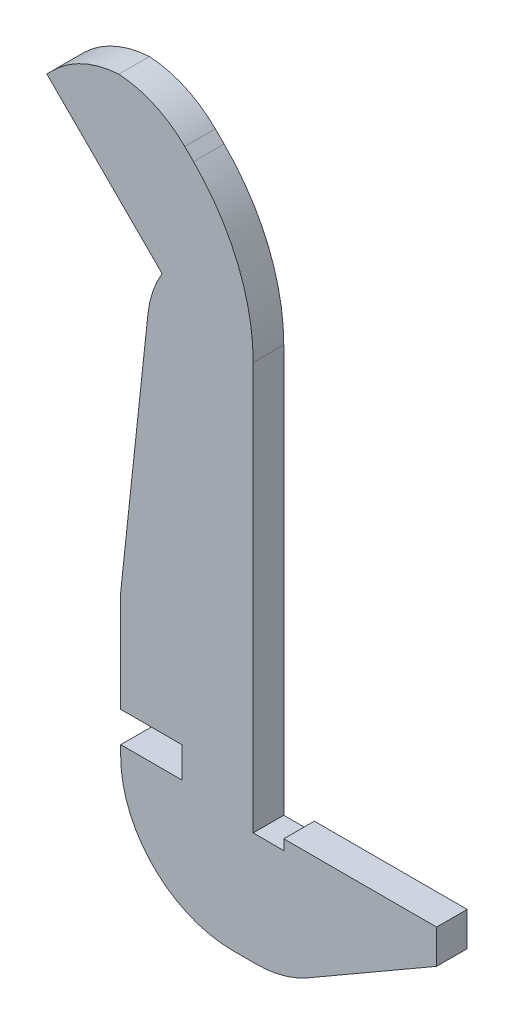
ISO-10303-21;
HEADER;
FILE_DESCRIPTION(('STEP AP214'),'2;1');
FILE_NAME('part.step','',(''),(''),'','','');
FILE_SCHEMA(('AUTOMOTIVE_DESIGN { 1 0 10303 214 1 1 1 1 }'));
ENDSEC;
DATA;
#1=APPLICATION_CONTEXT('core data for automotive mechanical design processes');
#2=APPLICATION_PROTOCOL_DEFINITION('international standard','automotive_design',2000,#1);
#3=PRODUCT_CONTEXT('',#1,'mechanical');
#4=PRODUCT('Part','Part','',(#3));
#5=PRODUCT_RELATED_PRODUCT_CATEGORY('part','',(#4));
#6=PRODUCT_DEFINITION_FORMATION('','',#4);
#7=PRODUCT_DEFINITION_CONTEXT('part definition',#1,'design');
#8=PRODUCT_DEFINITION('design','',#6,#7);
#9=PRODUCT_DEFINITION_SHAPE('','',#8);
#10=(LENGTH_UNIT() NAMED_UNIT(*) SI_UNIT(.MILLI.,.METRE.));
#11=(NAMED_UNIT(*) PLANE_ANGLE_UNIT() SI_UNIT($,.RADIAN.));
#12=(NAMED_UNIT(*) SI_UNIT($,.STERADIAN.) SOLID_ANGLE_UNIT());
#13=UNCERTAINTY_MEASURE_WITH_UNIT(LENGTH_MEASURE(1.E-05),#10,'distance_accuracy_value','');
#14=(GEOMETRIC_REPRESENTATION_CONTEXT(3) GLOBAL_UNCERTAINTY_ASSIGNED_CONTEXT((#13)) GLOBAL_UNIT_ASSIGNED_CONTEXT((#10,
#11,#12)) REPRESENTATION_CONTEXT('',''));
#15=CARTESIAN_POINT('',(0.,0.,0.));
#16=DIRECTION('',(0.,0.,1.));
#17=DIRECTION('',(1.,0.,0.));
#18=AXIS2_PLACEMENT_3D('',#15,#16,#17);
#19=CARTESIAN_POINT('',(-3.1,-1.2,0.15));
#20=DIRECTION('',(-1.,0.,0.));
#21=DIRECTION('',(0.,0.,1.));
#22=AXIS2_PLACEMENT_3D('',#19,#20,#21);
#23=PLANE('',#22);
#24=DIRECTION('',(0.,0.,1.));
#25=VECTOR('',#24,1.);
#26=CARTESIAN_POINT('',(-3.1,0.3,-0.15));
#27=LINE('',#26,#25);
#28=CARTESIAN_POINT('',(-3.1,0.3,-0.15));
#29=VERTEX_POINT('',#28);
#30=CARTESIAN_POINT('',(-3.1,0.3,0.15));
#31=VERTEX_POINT('',#30);
#32=EDGE_CURVE('E228',#29,#31,#27,.T.);
#33=ORIENTED_EDGE('',*,*,#32,.T.);
#34=DIRECTION('',(0.,1.,0.));
#35=VECTOR('',#34,1.);
#36=CARTESIAN_POINT('',(-3.1,-1.2,0.15));
#37=LINE('',#36,#35);
#38=CARTESIAN_POINT('',(-3.1,1.3,0.15));
#39=VERTEX_POINT('',#38);
#40=EDGE_CURVE('E359',#31,#39,#37,.T.);
#41=ORIENTED_EDGE('',*,*,#40,.T.);
#42=DIRECTION('',(0.,0.,-1.));
#43=VECTOR('',#42,1.);
#44=CARTESIAN_POINT('',(-3.1,1.3,0.15));
#45=LINE('',#44,#43);
#46=CARTESIAN_POINT('',(-3.1,1.3,-0.15));
#47=VERTEX_POINT('',#46);
#48=EDGE_CURVE('E280',#39,#47,#45,.T.);
#49=ORIENTED_EDGE('',*,*,#48,.T.);
#50=DIRECTION('',(0.,1.,0.));
#51=VECTOR('',#50,1.);
#52=CARTESIAN_POINT('',(-3.1,-1.2,-0.15));
#53=LINE('',#52,#51);
#54=EDGE_CURVE('E222',#29,#47,#53,.T.);
#55=ORIENTED_EDGE('',*,*,#54,.F.);
#56=EDGE_LOOP('',(#33,#41,#49,#55));
#57=FACE_BOUND('',#56,.T.);
#58=ADVANCED_FACE('F39',(#57),#23,.T.);
#59=CARTESIAN_POINT('',(-2.8,-1.2,0.15));
#60=DIRECTION('',(0.,1.,0.));
#61=DIRECTION('',(-1.,0.,0.));
#62=AXIS2_PLACEMENT_3D('',#59,#60,#61);
#63=PLANE('',#62);
#64=DIRECTION('',(1.,0.,0.));
#65=VECTOR('',#64,1.);
#66=CARTESIAN_POINT('',(-2.8,-1.2,-0.15));
#67=LINE('',#66,#65);
#68=CARTESIAN_POINT('',(-2.,-1.2,-0.15));
#69=VERTEX_POINT('',#68);
#70=CARTESIAN_POINT('',(-1.76794919243112,-1.2,-0.15));
#71=VERTEX_POINT('',#70);
#72=EDGE_CURVE('E254',#69,#71,#67,.T.);
#73=ORIENTED_EDGE('',*,*,#72,.T.);
#74=DIRECTION('',(0.,0.,-1.));
#75=VECTOR('',#74,1.);
#76=CARTESIAN_POINT('',(-1.76794919243112,-1.2,0.15));
#77=LINE('',#76,#75);
#78=CARTESIAN_POINT('',(-1.76794919243112,-1.2,0.15));
#79=VERTEX_POINT('',#78);
#80=EDGE_CURVE('E324',#71,#79,#77,.F.);
#81=ORIENTED_EDGE('',*,*,#80,.T.);
#82=DIRECTION('',(-1.,0.,0.));
#83=VECTOR('',#82,1.);
#84=CARTESIAN_POINT('',(-2.8,-1.2,0.15));
#85=LINE('',#84,#83);
#86=CARTESIAN_POINT('',(-2.,-1.2,0.15));
#87=VERTEX_POINT('',#86);
#88=EDGE_CURVE('E257',#79,#87,#85,.T.);
#89=ORIENTED_EDGE('',*,*,#88,.T.);
#90=DIRECTION('',(0.,0.,-1.));
#91=VECTOR('',#90,1.);
#92=CARTESIAN_POINT('',(-2.,-1.2,-0.15));
#93=LINE('',#92,#91);
#94=EDGE_CURVE('E261',#87,#69,#93,.T.);
#95=ORIENTED_EDGE('',*,*,#94,.T.);
#96=EDGE_LOOP('',(#73,#81,#89,#95));
#97=FACE_BOUND('',#96,.T.);
#98=ADVANCED_FACE('F426',(#97),#63,.F.);
#99=CARTESIAN_POINT('',(-1.5,-1.2,0.15));
#100=DIRECTION('',(-0.499999999999998,0.86602540378444,0.));
#101=DIRECTION('',(-0.86602540378444,-0.499999999999998,0.));
#102=AXIS2_PLACEMENT_3D('',#99,#100,#101);
#103=PLANE('',#102);
#104=DIRECTION('',(0.86602540378444,0.499999999999998,0.));
#105=VECTOR('',#104,1.);
#106=CARTESIAN_POINT('',(-1.5,-1.2,0.15));
#107=LINE('',#106,#105);
#108=CARTESIAN_POINT('',(-1.26794919243112,-1.06602540378444,0.15));
#109=VERTEX_POINT('',#108);
#110=CARTESIAN_POINT('',(0.,-0.333974596215566,0.15));
#111=VERTEX_POINT('',#110);
#112=EDGE_CURVE('E230',#109,#111,#107,.T.);
#113=ORIENTED_EDGE('',*,*,#112,.F.);
#114=DIRECTION('',(0.,0.,-1.));
#115=VECTOR('',#114,1.);
#116=CARTESIAN_POINT('',(-1.26794919243112,-1.06602540378444,0.15));
#117=LINE('',#116,#115);
#118=CARTESIAN_POINT('',(-1.26794919243112,-1.06602540378444,-0.15));
#119=VERTEX_POINT('',#118);
#120=EDGE_CURVE('E321',#109,#119,#117,.T.);
#121=ORIENTED_EDGE('',*,*,#120,.T.);
#122=DIRECTION('',(0.86602540378444,0.499999999999998,0.));
#123=VECTOR('',#122,1.);
#124=CARTESIAN_POINT('',(-1.5,-1.2,-0.15));
#125=LINE('',#124,#123);
#126=CARTESIAN_POINT('',(0.,-0.333974596215566,-0.15));
#127=VERTEX_POINT('',#126);
#128=EDGE_CURVE('E252',#119,#127,#125,.T.);
#129=ORIENTED_EDGE('',*,*,#128,.T.);
#130=DIRECTION('',(0.,0.,-1.));
#131=VECTOR('',#130,1.);
#132=CARTESIAN_POINT('',(0.,-0.333974596215566,0.15));
#133=LINE('',#132,#131);
#134=EDGE_CURVE('E258',#111,#127,#133,.T.);
#135=ORIENTED_EDGE('',*,*,#134,.F.);
#136=EDGE_LOOP('',(#113,#121,#129,#135));
#137=FACE_BOUND('',#136,.T.);
#138=ADVANCED_FACE('F382',(#137),#103,.F.);
#139=CARTESIAN_POINT('',(0.,-0.333974596215566,0.15));
#140=DIRECTION('',(-1.,0.,0.));
#141=DIRECTION('',(0.,-1.,0.));
#142=AXIS2_PLACEMENT_3D('',#139,#140,#141);
#143=PLANE('',#142);
#144=DIRECTION('',(0.,1.,0.));
#145=VECTOR('',#144,1.);
#146=CARTESIAN_POINT('',(0.,-0.333974596215566,-0.15));
#147=LINE('',#146,#145);
#148=CARTESIAN_POINT('',(0.,0.,-0.15));
#149=VERTEX_POINT('',#148);
#150=EDGE_CURVE('E250',#127,#149,#147,.T.);
#151=ORIENTED_EDGE('',*,*,#150,.T.);
#152=DIRECTION('',(0.,0.,-1.));
#153=VECTOR('',#152,1.);
#154=CARTESIAN_POINT('',(0.,0.,0.15));
#155=LINE('',#154,#153);
#156=CARTESIAN_POINT('',(0.,0.,0.15));
#157=VERTEX_POINT('',#156);
#158=EDGE_CURVE('E262',#157,#149,#155,.T.);
#159=ORIENTED_EDGE('',*,*,#158,.F.);
#160=DIRECTION('',(0.,1.,0.));
#161=VECTOR('',#160,1.);
#162=CARTESIAN_POINT('',(0.,-0.333974596215566,0.15));
#163=LINE('',#162,#161);
#164=EDGE_CURVE('E376',#111,#157,#163,.T.);
#165=ORIENTED_EDGE('',*,*,#164,.F.);
#166=ORIENTED_EDGE('',*,*,#134,.T.);
#167=EDGE_LOOP('',(#151,#159,#165,#166));
#168=FACE_BOUND('',#167,.T.);
#169=ADVANCED_FACE('F386',(#168),#143,.F.);
#170=CARTESIAN_POINT('',(0.,0.,0.15));
#171=DIRECTION('',(0.,-1.,0.));
#172=DIRECTION('',(0.,0.,-1.));
#173=AXIS2_PLACEMENT_3D('',#170,#171,#172);
#174=PLANE('',#173);
#175=DIRECTION('',(-1.,0.,0.));
#176=VECTOR('',#175,1.);
#177=CARTESIAN_POINT('',(0.,0.,-0.15));
#178=LINE('',#177,#176);
#179=CARTESIAN_POINT('',(-1.5,0.,-0.15));
#180=VERTEX_POINT('',#179);
#181=EDGE_CURVE('E248',#149,#180,#178,.T.);
#182=ORIENTED_EDGE('',*,*,#181,.T.);
#183=DIRECTION('',(0.,0.,-1.));
#184=VECTOR('',#183,1.);
#185=CARTESIAN_POINT('',(-1.5,0.,0.15));
#186=LINE('',#185,#184);
#187=CARTESIAN_POINT('',(-1.5,0.,0.15));
#188=VERTEX_POINT('',#187);
#189=EDGE_CURVE('E265',#188,#180,#186,.T.);
#190=ORIENTED_EDGE('',*,*,#189,.F.);
#191=DIRECTION('',(-1.,0.,0.));
#192=VECTOR('',#191,1.);
#193=CARTESIAN_POINT('',(0.,0.,0.15));
#194=LINE('',#193,#192);
#195=EDGE_CURVE('E375',#157,#188,#194,.T.);
#196=ORIENTED_EDGE('',*,*,#195,.F.);
#197=ORIENTED_EDGE('',*,*,#158,.T.);
#198=EDGE_LOOP('',(#182,#190,#196,#197));
#199=FACE_BOUND('',#198,.T.);
#200=ADVANCED_FACE('F391',(#199),#174,.F.);
#201=CARTESIAN_POINT('',(-1.5,0.,0.15));
#202=DIRECTION('',(1.,0.,0.));
#203=DIRECTION('',(0.,0.,-1.));
#204=AXIS2_PLACEMENT_3D('',#201,#202,#203);
#205=PLANE('',#204);
#206=DIRECTION('',(0.,-1.,0.));
#207=VECTOR('',#206,1.);
#208=CARTESIAN_POINT('',(-1.5,0.,-0.15));
#209=LINE('',#208,#207);
#210=CARTESIAN_POINT('',(-1.5,-0.1,-0.15));
#211=VERTEX_POINT('',#210);
#212=EDGE_CURVE('E246',#180,#211,#209,.T.);
#213=ORIENTED_EDGE('',*,*,#212,.T.);
#214=DIRECTION('',(0.,0.,-1.));
#215=VECTOR('',#214,1.);
#216=CARTESIAN_POINT('',(-1.5,-0.1,0.15));
#217=LINE('',#216,#215);
#218=CARTESIAN_POINT('',(-1.5,-0.1,0.15));
#219=VERTEX_POINT('',#218);
#220=EDGE_CURVE('E268',#219,#211,#217,.T.);
#221=ORIENTED_EDGE('',*,*,#220,.F.);
#222=DIRECTION('',(0.,-1.,0.));
#223=VECTOR('',#222,1.);
#224=CARTESIAN_POINT('',(-1.5,0.,0.15));
#225=LINE('',#224,#223);
#226=EDGE_CURVE('E373',#188,#219,#225,.T.);
#227=ORIENTED_EDGE('',*,*,#226,.F.);
#228=ORIENTED_EDGE('',*,*,#189,.T.);
#229=EDGE_LOOP('',(#213,#221,#227,#228));
#230=FACE_BOUND('',#229,.T.);
#231=ADVANCED_FACE('F397',(#230),#205,.F.);
#232=CARTESIAN_POINT('',(-1.5,-0.1,0.15));
#233=DIRECTION('',(0.,-1.,0.));
#234=DIRECTION('',(1.,0.,0.));
#235=AXIS2_PLACEMENT_3D('',#232,#233,#234);
#236=PLANE('',#235);
#237=DIRECTION('',(-1.,0.,0.));
#238=VECTOR('',#237,1.);
#239=CARTESIAN_POINT('',(-1.5,-0.1,-0.15));
#240=LINE('',#239,#238);
#241=CARTESIAN_POINT('',(-1.8,-0.1,-0.15));
#242=VERTEX_POINT('',#241);
#243=EDGE_CURVE('E244',#211,#242,#240,.T.);
#244=ORIENTED_EDGE('',*,*,#243,.T.);
#245=DIRECTION('',(0.,0.,-1.));
#246=VECTOR('',#245,1.);
#247=CARTESIAN_POINT('',(-1.8,-0.1,0.15));
#248=LINE('',#247,#246);
#249=CARTESIAN_POINT('',(-1.8,-0.1,0.15));
#250=VERTEX_POINT('',#249);
#251=EDGE_CURVE('E271',#250,#242,#248,.T.);
#252=ORIENTED_EDGE('',*,*,#251,.F.);
#253=DIRECTION('',(-1.,0.,0.));
#254=VECTOR('',#253,1.);
#255=CARTESIAN_POINT('',(-1.5,-0.1,0.15));
#256=LINE('',#255,#254);
#257=EDGE_CURVE('E370',#219,#250,#256,.T.);
#258=ORIENTED_EDGE('',*,*,#257,.F.);
#259=ORIENTED_EDGE('',*,*,#220,.T.);
#260=EDGE_LOOP('',(#244,#252,#258,#259));
#261=FACE_BOUND('',#260,.T.);
#262=ADVANCED_FACE('F401',(#261),#236,.F.);
#263=CARTESIAN_POINT('',(-1.8,-0.1,0.15));
#264=DIRECTION('',(-1.,0.,0.));
#265=DIRECTION('',(0.,0.,1.));
#266=AXIS2_PLACEMENT_3D('',#263,#264,#265);
#267=PLANE('',#266);
#268=DIRECTION('',(0.,1.,0.));
#269=VECTOR('',#268,1.);
#270=CARTESIAN_POINT('',(-1.8,-0.1,-0.15));
#271=LINE('',#270,#269);
#272=CARTESIAN_POINT('',(-1.8,3.89791847198289,-0.15));
#273=VERTEX_POINT('',#272);
#274=EDGE_CURVE('E240',#242,#273,#271,.T.);
#275=ORIENTED_EDGE('',*,*,#274,.T.);
#276=DIRECTION('',(0.,0.,-1.));
#277=VECTOR('',#276,1.);
#278=CARTESIAN_POINT('',(-1.8,3.89791847198289,0.15));
#279=LINE('',#278,#277);
#280=CARTESIAN_POINT('',(-1.8,3.89791847198289,0.15));
#281=VERTEX_POINT('',#280);
#282=EDGE_CURVE('E298',#273,#281,#279,.F.);
#283=ORIENTED_EDGE('',*,*,#282,.T.);
#284=DIRECTION('',(0.,1.,0.));
#285=VECTOR('',#284,1.);
#286=CARTESIAN_POINT('',(-1.8,3.51721108150116,0.15));
#287=LINE('',#286,#285);
#288=EDGE_CURVE('E366',#250,#281,#287,.T.);
#289=ORIENTED_EDGE('',*,*,#288,.F.);
#290=ORIENTED_EDGE('',*,*,#251,.T.);
#291=EDGE_LOOP('',(#275,#283,#289,#290));
#292=FACE_BOUND('',#291,.T.);
#293=ADVANCED_FACE('F404',(#292),#267,.F.);
#294=CARTESIAN_POINT('',(-1.8,4.72634559672908,0.15));
#295=DIRECTION('',(-0.70710678118655,-0.707106781186545,0.));
#296=DIRECTION('',(0.707106781186545,-0.70710678118655,0.));
#297=AXIS2_PLACEMENT_3D('',#294,#295,#296);
#298=PLANE('',#297);
#299=DIRECTION('',(-0.707106781186545,0.707106781186551,0.));
#300=VECTOR('',#299,1.);
#301=CARTESIAN_POINT('',(-1.8,4.72634559672908,-0.15));
#302=LINE('',#301,#300);
#303=CARTESIAN_POINT('',(-2.3857864376269,5.31213203435598,-0.15));
#304=VERTEX_POINT('',#303);
#305=CARTESIAN_POINT('',(-2.47175144212722,5.3980970388563,-0.15));
#306=VERTEX_POINT('',#305);
#307=EDGE_CURVE('E237',#304,#306,#302,.T.);
#308=ORIENTED_EDGE('',*,*,#307,.T.);
#309=DIRECTION('',(0.,0.,-1.));
#310=VECTOR('',#309,1.);
#311=CARTESIAN_POINT('',(-2.47175144212722,5.3980970388563,0.15));
#312=LINE('',#311,#310);
#313=CARTESIAN_POINT('',(-2.47175144212722,5.3980970388563,0.15));
#314=VERTEX_POINT('',#313);
#315=EDGE_CURVE('E11',#306,#314,#312,.F.);
#316=ORIENTED_EDGE('',*,*,#315,.T.);
#317=DIRECTION('',(-0.707106781186545,0.707106781186551,0.));
#318=VECTOR('',#317,1.);
#319=CARTESIAN_POINT('',(-1.8,4.72634559672908,0.15));
#320=LINE('',#319,#318);
#321=CARTESIAN_POINT('',(-2.3857864376269,5.31213203435598,0.15));
#322=VERTEX_POINT('',#321);
#323=EDGE_CURVE('E364',#322,#314,#320,.T.);
#324=ORIENTED_EDGE('',*,*,#323,.F.);
#325=DIRECTION('',(0.,0.,-1.));
#326=VECTOR('',#325,1.);
#327=CARTESIAN_POINT('',(-2.3857864376269,5.31213203435598,0.15));
#328=LINE('',#327,#326);
#329=EDGE_CURVE('E292',#322,#304,#328,.T.);
#330=ORIENTED_EDGE('',*,*,#329,.T.);
#331=EDGE_LOOP('',(#308,#316,#324,#330));
#332=FACE_BOUND('',#331,.T.);
#333=ADVANCED_FACE('F413',(#332),#298,.F.);
#334=CARTESIAN_POINT('',(-3.47175144212721,5.69099025766976,0.15));
#335=DIRECTION('',(0.707106781186545,-0.70710678118655,0.));
#336=DIRECTION('',(0.70710678118655,0.707106781186545,0.));
#337=AXIS2_PLACEMENT_3D('',#334,#335,#336);
#338=PLANE('',#337);
#339=DIRECTION('',(-0.70710678118655,-0.707106781186545,0.));
#340=VECTOR('',#339,1.);
#341=CARTESIAN_POINT('',(-3.47175144212721,5.69099025766976,0.15));
#342=LINE('',#341,#340);
#343=CARTESIAN_POINT('',(-3.76464466094066,5.39809703885631,0.15));
#344=VERTEX_POINT('',#343);
#345=CARTESIAN_POINT('',(-3.82530483272049,5.33743686707648,0.15));
#346=VERTEX_POINT('',#345);
#347=EDGE_CURVE('E333',#344,#346,#342,.T.);
#348=ORIENTED_EDGE('',*,*,#347,.F.);
#349=DIRECTION('',(0.,0.,-1.));
#350=VECTOR('',#349,1.);
#351=CARTESIAN_POINT('',(-3.76464466094067,5.39809703885631,0.15));
#352=LINE('',#351,#350);
#353=CARTESIAN_POINT('',(-3.76464466094066,5.39809703885631,-0.15));
#354=VERTEX_POINT('',#353);
#355=EDGE_CURVE('E48',#344,#354,#352,.T.);
#356=ORIENTED_EDGE('',*,*,#355,.T.);
#357=DIRECTION('',(-0.70710678118655,-0.707106781186545,0.));
#358=VECTOR('',#357,1.);
#359=CARTESIAN_POINT('',(-3.47175144212721,5.69099025766976,-0.15));
#360=LINE('',#359,#358);
#361=CARTESIAN_POINT('',(-3.82530483272049,5.33743686707648,-0.15));
#362=VERTEX_POINT('',#361);
#363=EDGE_CURVE('E235',#354,#362,#360,.T.);
#364=ORIENTED_EDGE('',*,*,#363,.T.);
#365=DIRECTION('',(0.,0.,-1.));
#366=VECTOR('',#365,1.);
#367=CARTESIAN_POINT('',(-3.82530483272049,5.33743686707648,0.15));
#368=LINE('',#367,#366);
#369=EDGE_CURVE('E274',#346,#362,#368,.T.);
#370=ORIENTED_EDGE('',*,*,#369,.F.);
#371=EDGE_LOOP('',(#348,#356,#364,#370));
#372=FACE_BOUND('',#371,.T.);
#373=ADVANCED_FACE('F331',(#372),#338,.F.);
#374=CARTESIAN_POINT('',(-2.69393398282202,4.206066017178,0.15));
#375=DIRECTION('',(-0.707106781186551,-0.707106781186544,0.));
#376=DIRECTION('',(0.707106781186544,-0.707106781186551,0.));
#377=AXIS2_PLACEMENT_3D('',#374,#375,#376);
#378=PLANE('',#377);
#379=DIRECTION('',(-0.707106781186544,0.707106781186551,0.));
#380=VECTOR('',#379,1.);
#381=CARTESIAN_POINT('',(-2.69393398282202,4.206066017178,-0.15));
#382=LINE('',#381,#380);
#383=CARTESIAN_POINT('',(-2.69393398282202,4.206066017178,-0.15));
#384=VERTEX_POINT('',#383);
#385=EDGE_CURVE('E225',#384,#362,#382,.T.);
#386=ORIENTED_EDGE('',*,*,#385,.F.);
#387=DIRECTION('',(0.,0.,-1.));
#388=VECTOR('',#387,1.);
#389=CARTESIAN_POINT('',(-2.69393398282202,4.206066017178,0.15));
#390=LINE('',#389,#388);
#391=CARTESIAN_POINT('',(-2.69393398282202,4.206066017178,0.15));
#392=VERTEX_POINT('',#391);
#393=EDGE_CURVE('E277',#392,#384,#390,.T.);
#394=ORIENTED_EDGE('',*,*,#393,.F.);
#395=DIRECTION('',(-0.707106781186544,0.707106781186551,0.));
#396=VECTOR('',#395,1.);
#397=CARTESIAN_POINT('',(-2.69393398282202,4.206066017178,0.15));
#398=LINE('',#397,#396);
#399=EDGE_CURVE('E351',#392,#346,#398,.T.);
#400=ORIENTED_EDGE('',*,*,#399,.T.);
#401=ORIENTED_EDGE('',*,*,#369,.T.);
#402=EDGE_LOOP('',(#386,#394,#400,#401));
#403=FACE_BOUND('',#402,.T.);
#404=ADVANCED_FACE('F339',(#403),#378,.T.);
#405=CARTESIAN_POINT('',(-3.1,1.3,0.15));
#406=DIRECTION('',(-0.994309153919809,0.106533123634264,0.));
#407=DIRECTION('',(-0.106533123634264,-0.994309153919809,0.));
#408=AXIS2_PLACEMENT_3D('',#405,#406,#407);
#409=PLANE('',#408);
#410=DIRECTION('',(0.106533123634264,0.994309153919809,0.));
#411=VECTOR('',#410,1.);
#412=CARTESIAN_POINT('',(-3.1,1.3,0.15));
#413=LINE('',#412,#411);
#414=CARTESIAN_POINT('',(-2.832691197951,3.79488215245738,0.15));
#415=VERTEX_POINT('',#414);
#416=EDGE_CURVE('E350',#39,#415,#413,.T.);
#417=ORIENTED_EDGE('',*,*,#416,.T.);
#418=DIRECTION('',(0.,0.,-1.));
#419=VECTOR('',#418,1.);
#420=CARTESIAN_POINT('',(-2.832691197951,3.79488215245738,-0.15));
#421=LINE('',#420,#419);
#422=CARTESIAN_POINT('',(-2.832691197951,3.79488215245738,-0.15));
#423=VERTEX_POINT('',#422);
#424=EDGE_CURVE('E304',#415,#423,#421,.T.);
#425=ORIENTED_EDGE('',*,*,#424,.T.);
#426=DIRECTION('',(0.106533123634264,0.994309153919809,0.));
#427=VECTOR('',#426,1.);
#428=CARTESIAN_POINT('',(-3.1,1.3,-0.15));
#429=LINE('',#428,#427);
#430=EDGE_CURVE('E221',#47,#423,#429,.T.);
#431=ORIENTED_EDGE('',*,*,#430,.F.);
#432=ORIENTED_EDGE('',*,*,#48,.F.);
#433=EDGE_LOOP('',(#417,#425,#431,#432));
#434=FACE_BOUND('',#433,.T.);
#435=ADVANCED_FACE('F354',(#434),#409,.T.);
#436=DIRECTION('',(0.,0.,1.));
#437=VECTOR('',#436,1.);
#438=CARTESIAN_POINT('',(-3.1,0.,-0.15));
#439=LINE('',#438,#437);
#440=CARTESIAN_POINT('',(-3.1,0.,-0.15));
#441=VERTEX_POINT('',#440);
#442=CARTESIAN_POINT('',(-3.1,0.,0.15));
#443=VERTEX_POINT('',#442);
#444=EDGE_CURVE('E198',#441,#443,#439,.T.);
#445=ORIENTED_EDGE('',*,*,#444,.F.);
#446=CARTESIAN_POINT('',(-3.1,-0.1,-0.15));
#447=VERTEX_POINT('',#446);
#448=EDGE_CURVE('E211',#447,#441,#53,.T.);
#449=ORIENTED_EDGE('',*,*,#448,.F.);
#450=DIRECTION('',(0.,0.,-1.));
#451=VECTOR('',#450,1.);
#452=CARTESIAN_POINT('',(-3.1,-0.1,0.15));
#453=LINE('',#452,#451);
#454=CARTESIAN_POINT('',(-3.1,-0.1,0.15));
#455=VERTEX_POINT('',#454);
#456=EDGE_CURVE('E287',#447,#455,#453,.F.);
#457=ORIENTED_EDGE('',*,*,#456,.T.);
#458=EDGE_CURVE('E214',#455,#443,#37,.T.);
#459=ORIENTED_EDGE('',*,*,#458,.T.);
#460=EDGE_LOOP('',(#445,#449,#457,#459));
#461=FACE_BOUND('',#460,.T.);
#462=ADVANCED_FACE('F210',(#461),#23,.T.);
#463=CARTESIAN_POINT('',(0.,0.,0.15));
#464=DIRECTION('',(0.,0.,-1.));
#465=DIRECTION('',(-1.,0.,0.));
#466=AXIS2_PLACEMENT_3D('',#463,#464,#465);
#467=PLANE('',#466);
#468=ORIENTED_EDGE('',*,*,#399,.F.);
#469=CARTESIAN_POINT('',(-1.83838204403119,3.68834902882312,0.15));
#470=DIRECTION('',(0.,0.,-1.));
#471=DIRECTION('',(-1.,0.,0.));
#472=AXIS2_PLACEMENT_3D('',#469,#470,#471);
#473=CIRCLE('',#472,1.);
#474=EDGE_CURVE('E319',#392,#415,#473,.F.);
#475=ORIENTED_EDGE('',*,*,#474,.T.);
#476=ORIENTED_EDGE('',*,*,#416,.F.);
#477=ORIENTED_EDGE('',*,*,#40,.F.);
#478=DIRECTION('',(-1.,0.,0.));
#479=VECTOR('',#478,1.);
#480=CARTESIAN_POINT('',(-2.5,0.3,0.15));
#481=LINE('',#480,#479);
#482=CARTESIAN_POINT('',(-2.5,0.3,0.15));
#483=VERTEX_POINT('',#482);
#484=EDGE_CURVE('E205',#483,#31,#481,.T.);
#485=ORIENTED_EDGE('',*,*,#484,.F.);
#486=DIRECTION('',(0.,1.,0.));
#487=VECTOR('',#486,1.);
#488=CARTESIAN_POINT('',(-2.5,0.,0.15));
#489=LINE('',#488,#487);
#490=CARTESIAN_POINT('',(-2.5,0.,0.15));
#491=VERTEX_POINT('',#490);
#492=EDGE_CURVE('E487',#491,#483,#489,.T.);
#493=ORIENTED_EDGE('',*,*,#492,.F.);
#494=DIRECTION('',(1.,0.,0.));
#495=VECTOR('',#494,1.);
#496=CARTESIAN_POINT('',(-3.1,0.,0.15));
#497=LINE('',#496,#495);
#498=EDGE_CURVE('E417',#443,#491,#497,.T.);
#499=ORIENTED_EDGE('',*,*,#498,.F.);
#500=ORIENTED_EDGE('',*,*,#458,.F.);
#501=CARTESIAN_POINT('',(-2.,-0.1,0.15));
#502=DIRECTION('',(0.,0.,-1.));
#503=DIRECTION('',(-1.,0.,0.));
#504=AXIS2_PLACEMENT_3D('',#501,#502,#503);
#505=CIRCLE('',#504,1.1);
#506=EDGE_CURVE('E289',#455,#87,#505,.F.);
#507=ORIENTED_EDGE('',*,*,#506,.T.);
#508=ORIENTED_EDGE('',*,*,#88,.F.);
#509=CARTESIAN_POINT('',(-1.76794919243112,-0.2,0.15));
#510=DIRECTION('',(0.,0.,-1.));
#511=DIRECTION('',(-1.,0.,0.));
#512=AXIS2_PLACEMENT_3D('',#509,#510,#511);
#513=CIRCLE('',#512,1.);
#514=EDGE_CURVE('E62',#79,#109,#513,.F.);
#515=ORIENTED_EDGE('',*,*,#514,.T.);
#516=ORIENTED_EDGE('',*,*,#112,.T.);
#517=ORIENTED_EDGE('',*,*,#164,.T.);
#518=ORIENTED_EDGE('',*,*,#195,.T.);
#519=ORIENTED_EDGE('',*,*,#226,.T.);
#520=ORIENTED_EDGE('',*,*,#257,.T.);
#521=ORIENTED_EDGE('',*,*,#288,.T.);
#522=CARTESIAN_POINT('',(-3.8,3.89791847198289,0.15));
#523=DIRECTION('',(0.,0.,-1.));
#524=DIRECTION('',(-1.,0.,0.));
#525=AXIS2_PLACEMENT_3D('',#522,#523,#524);
#526=CIRCLE('',#525,2.);
#527=EDGE_CURVE('E301',#281,#322,#526,.F.);
#528=ORIENTED_EDGE('',*,*,#527,.T.);
#529=ORIENTED_EDGE('',*,*,#323,.T.);
#530=CARTESIAN_POINT('',(-3.17885822331377,4.69099025766976,0.15));
#531=DIRECTION('',(0.,0.,-1.));
#532=DIRECTION('',(-1.,0.,0.));
#533=AXIS2_PLACEMENT_3D('',#530,#531,#532);
#534=CIRCLE('',#533,1.);
#535=CARTESIAN_POINT('',(-3.11819805153395,5.68914873384458,0.15));
#536=VERTEX_POINT('',#535);
#537=EDGE_CURVE('E55',#314,#536,#534,.F.);
#538=ORIENTED_EDGE('',*,*,#537,.T.);
#539=CARTESIAN_POINT('',(-3.05753787975412,4.69099025766976,0.15));
#540=DIRECTION('',(0.,0.,-1.));
#541=DIRECTION('',(-1.,0.,0.));
#542=AXIS2_PLACEMENT_3D('',#539,#540,#541);
#543=CIRCLE('',#542,1.);
#544=EDGE_CURVE('E316',#536,#344,#543,.F.);
#545=ORIENTED_EDGE('',*,*,#544,.T.);
#546=ORIENTED_EDGE('',*,*,#347,.T.);
#547=EDGE_LOOP('',(#468,#475,#476,#477,#485,#493,#499,#500,#507,#508,#515,#516,#517,#518,#519,
#520,#521,#528,#529,#538,#545,#546));
#548=FACE_BOUND('',#547,.T.);
#549=ADVANCED_FACE('F348',(#548),#467,.F.);
#550=CARTESIAN_POINT('',(0.,0.,-0.15));
#551=DIRECTION('',(0.,0.,-1.));
#552=DIRECTION('',(-1.,0.,0.));
#553=AXIS2_PLACEMENT_3D('',#550,#551,#552);
#554=PLANE('',#553);
#555=ORIENTED_EDGE('',*,*,#430,.T.);
#556=CARTESIAN_POINT('',(-1.83838204403119,3.68834902882312,-0.15));
#557=DIRECTION('',(0.,0.,-1.));
#558=DIRECTION('',(-1.,0.,0.));
#559=AXIS2_PLACEMENT_3D('',#556,#557,#558);
#560=CIRCLE('',#559,1.);
#561=EDGE_CURVE('E313',#423,#384,#560,.T.);
#562=ORIENTED_EDGE('',*,*,#561,.T.);
#563=ORIENTED_EDGE('',*,*,#385,.T.);
#564=ORIENTED_EDGE('',*,*,#363,.F.);
#565=CARTESIAN_POINT('',(-3.05753787975412,4.69099025766976,-0.15));
#566=DIRECTION('',(0.,0.,-1.));
#567=DIRECTION('',(-1.,0.,0.));
#568=AXIS2_PLACEMENT_3D('',#565,#566,#567);
#569=CIRCLE('',#568,1.);
#570=CARTESIAN_POINT('',(-3.11819805153395,5.68914873384458,-0.15));
#571=VERTEX_POINT('',#570);
#572=EDGE_CURVE('E309',#354,#571,#569,.T.);
#573=ORIENTED_EDGE('',*,*,#572,.T.);
#574=CARTESIAN_POINT('',(-3.17885822331377,4.69099025766976,-0.15));
#575=DIRECTION('',(0.,0.,-1.));
#576=DIRECTION('',(-1.,0.,0.));
#577=AXIS2_PLACEMENT_3D('',#574,#575,#576);
#578=CIRCLE('',#577,1.);
#579=EDGE_CURVE('E307',#571,#306,#578,.T.);
#580=ORIENTED_EDGE('',*,*,#579,.T.);
#581=ORIENTED_EDGE('',*,*,#307,.F.);
#582=CARTESIAN_POINT('',(-3.8,3.89791847198289,-0.15));
#583=DIRECTION('',(0.,0.,-1.));
#584=DIRECTION('',(-1.,0.,0.));
#585=AXIS2_PLACEMENT_3D('',#582,#583,#584);
#586=CIRCLE('',#585,2.);
#587=EDGE_CURVE('E295',#304,#273,#586,.T.);
#588=ORIENTED_EDGE('',*,*,#587,.T.);
#589=ORIENTED_EDGE('',*,*,#274,.F.);
#590=ORIENTED_EDGE('',*,*,#243,.F.);
#591=ORIENTED_EDGE('',*,*,#212,.F.);
#592=ORIENTED_EDGE('',*,*,#181,.F.);
#593=ORIENTED_EDGE('',*,*,#150,.F.);
#594=ORIENTED_EDGE('',*,*,#128,.F.);
#595=CARTESIAN_POINT('',(-1.76794919243112,-0.2,-0.15));
#596=DIRECTION('',(0.,0.,-1.));
#597=DIRECTION('',(-1.,0.,0.));
#598=AXIS2_PLACEMENT_3D('',#595,#596,#597);
#599=CIRCLE('',#598,1.);
#600=EDGE_CURVE('E311',#119,#71,#599,.T.);
#601=ORIENTED_EDGE('',*,*,#600,.T.);
#602=ORIENTED_EDGE('',*,*,#72,.F.);
#603=CARTESIAN_POINT('',(-2.,-0.1,-0.15));
#604=DIRECTION('',(0.,0.,-1.));
#605=DIRECTION('',(-1.,0.,0.));
#606=AXIS2_PLACEMENT_3D('',#603,#604,#605);
#607=CIRCLE('',#606,1.1);
#608=EDGE_CURVE('E220',#69,#447,#607,.T.);
#609=ORIENTED_EDGE('',*,*,#608,.T.);
#610=ORIENTED_EDGE('',*,*,#448,.T.);
#611=DIRECTION('',(1.,0.,0.));
#612=VECTOR('',#611,1.);
#613=CARTESIAN_POINT('',(-3.1,0.,-0.15));
#614=LINE('',#613,#612);
#615=CARTESIAN_POINT('',(-2.5,0.,-0.15));
#616=VERTEX_POINT('',#615);
#617=EDGE_CURVE('E194',#441,#616,#614,.T.);
#618=ORIENTED_EDGE('',*,*,#617,.T.);
#619=DIRECTION('',(0.,1.,0.));
#620=VECTOR('',#619,1.);
#621=CARTESIAN_POINT('',(-2.5,0.,-0.15));
#622=LINE('',#621,#620);
#623=CARTESIAN_POINT('',(-2.5,0.3,-0.15));
#624=VERTEX_POINT('',#623);
#625=EDGE_CURVE('E204',#616,#624,#622,.T.);
#626=ORIENTED_EDGE('',*,*,#625,.T.);
#627=DIRECTION('',(-1.,0.,0.));
#628=VECTOR('',#627,1.);
#629=CARTESIAN_POINT('',(-2.5,0.3,-0.15));
#630=LINE('',#629,#628);
#631=EDGE_CURVE('E215',#624,#29,#630,.T.);
#632=ORIENTED_EDGE('',*,*,#631,.T.);
#633=ORIENTED_EDGE('',*,*,#54,.T.);
#634=EDGE_LOOP('',(#555,#562,#563,#564,#573,#580,#581,#588,#589,#590,#591,#592,#593,#594,#601,
#602,#609,#610,#618,#626,#632,#633));
#635=FACE_BOUND('',#634,.T.);
#636=ADVANCED_FACE('F218',(#635),#554,.T.);
#637=CARTESIAN_POINT('',(-2.,-0.1,0.15));
#638=DIRECTION('',(0.,0.,1.));
#639=DIRECTION('',(1.,0.,0.));
#640=AXIS2_PLACEMENT_3D('',#637,#638,#639);
#641=CYLINDRICAL_SURFACE('',#640,1.1);
#642=ORIENTED_EDGE('',*,*,#506,.F.);
#643=ORIENTED_EDGE('',*,*,#456,.F.);
#644=ORIENTED_EDGE('',*,*,#608,.F.);
#645=ORIENTED_EDGE('',*,*,#94,.F.);
#646=EDGE_LOOP('',(#642,#643,#644,#645));
#647=FACE_BOUND('',#646,.T.);
#648=ADVANCED_FACE('F465',(#647),#641,.T.);
#649=CARTESIAN_POINT('',(-2.5,0.3,-0.15));
#650=DIRECTION('',(0.,1.,0.));
#651=DIRECTION('',(-1.,0.,0.));
#652=AXIS2_PLACEMENT_3D('',#649,#650,#651);
#653=PLANE('',#652);
#654=ORIENTED_EDGE('',*,*,#484,.T.);
#655=ORIENTED_EDGE('',*,*,#32,.F.);
#656=ORIENTED_EDGE('',*,*,#631,.F.);
#657=DIRECTION('',(0.,0.,1.));
#658=VECTOR('',#657,1.);
#659=CARTESIAN_POINT('',(-2.5,0.3,-0.15));
#660=LINE('',#659,#658);
#661=EDGE_CURVE('E483',#624,#483,#660,.T.);
#662=ORIENTED_EDGE('',*,*,#661,.T.);
#663=EDGE_LOOP('',(#654,#655,#656,#662));
#664=FACE_BOUND('',#663,.T.);
#665=ADVANCED_FACE('F472',(#664),#653,.F.);
#666=CARTESIAN_POINT('',(-2.5,0.,-0.15));
#667=DIRECTION('',(1.,0.,0.));
#668=DIRECTION('',(0.,0.,-1.));
#669=AXIS2_PLACEMENT_3D('',#666,#667,#668);
#670=PLANE('',#669);
#671=ORIENTED_EDGE('',*,*,#492,.T.);
#672=ORIENTED_EDGE('',*,*,#661,.F.);
#673=ORIENTED_EDGE('',*,*,#625,.F.);
#674=DIRECTION('',(0.,0.,1.));
#675=VECTOR('',#674,1.);
#676=CARTESIAN_POINT('',(-2.5,0.,-0.15));
#677=LINE('',#676,#675);
#678=EDGE_CURVE('E200',#616,#491,#677,.T.);
#679=ORIENTED_EDGE('',*,*,#678,.T.);
#680=EDGE_LOOP('',(#671,#672,#673,#679));
#681=FACE_BOUND('',#680,.T.);
#682=ADVANCED_FACE('F469',(#681),#670,.F.);
#683=CARTESIAN_POINT('',(-3.1,0.,-0.15));
#684=DIRECTION('',(0.,-1.,0.));
#685=DIRECTION('',(0.,0.,-1.));
#686=AXIS2_PLACEMENT_3D('',#683,#684,#685);
#687=PLANE('',#686);
#688=ORIENTED_EDGE('',*,*,#498,.T.);
#689=ORIENTED_EDGE('',*,*,#678,.F.);
#690=ORIENTED_EDGE('',*,*,#617,.F.);
#691=ORIENTED_EDGE('',*,*,#444,.T.);
#692=EDGE_LOOP('',(#688,#689,#690,#691));
#693=FACE_BOUND('',#692,.T.);
#694=ADVANCED_FACE('F197',(#693),#687,.F.);
#695=CARTESIAN_POINT('',(-3.8,3.89791847198289,0.15));
#696=DIRECTION('',(0.,0.,-1.));
#697=DIRECTION('',(-1.,0.,0.));
#698=AXIS2_PLACEMENT_3D('',#695,#696,#697);
#699=CYLINDRICAL_SURFACE('',#698,2.);
#700=ORIENTED_EDGE('',*,*,#527,.F.);
#701=ORIENTED_EDGE('',*,*,#282,.F.);
#702=ORIENTED_EDGE('',*,*,#587,.F.);
#703=ORIENTED_EDGE('',*,*,#329,.F.);
#704=EDGE_LOOP('',(#700,#701,#702,#703));
#705=FACE_BOUND('',#704,.T.);
#706=ADVANCED_FACE('F410',(#705),#699,.T.);
#707=CARTESIAN_POINT('',(-1.83838204403119,3.68834902882312,0.15));
#708=DIRECTION('',(0.,0.,1.));
#709=DIRECTION('',(1.,0.,0.));
#710=AXIS2_PLACEMENT_3D('',#707,#708,#709);
#711=CYLINDRICAL_SURFACE('',#710,1.);
#712=ORIENTED_EDGE('',*,*,#474,.F.);
#713=ORIENTED_EDGE('',*,*,#393,.T.);
#714=ORIENTED_EDGE('',*,*,#561,.F.);
#715=ORIENTED_EDGE('',*,*,#424,.F.);
#716=EDGE_LOOP('',(#712,#713,#714,#715));
#717=FACE_BOUND('',#716,.T.);
#718=ADVANCED_FACE('F344',(#717),#711,.T.);
#719=CARTESIAN_POINT('',(-1.76794919243112,-0.2,0.15));
#720=DIRECTION('',(0.,0.,-1.));
#721=DIRECTION('',(-1.,0.,0.));
#722=AXIS2_PLACEMENT_3D('',#719,#720,#721);
#723=CYLINDRICAL_SURFACE('',#722,1.);
#724=ORIENTED_EDGE('',*,*,#514,.F.);
#725=ORIENTED_EDGE('',*,*,#80,.F.);
#726=ORIENTED_EDGE('',*,*,#600,.F.);
#727=ORIENTED_EDGE('',*,*,#120,.F.);
#728=EDGE_LOOP('',(#724,#725,#726,#727));
#729=FACE_BOUND('',#728,.T.);
#730=ADVANCED_FACE('F423',(#729),#723,.T.);
#731=CARTESIAN_POINT('',(-3.17885822331377,4.69099025766976,0.15));
#732=DIRECTION('',(0.,0.,-1.));
#733=DIRECTION('',(-1.,0.,0.));
#734=AXIS2_PLACEMENT_3D('',#731,#732,#733);
#735=CYLINDRICAL_SURFACE('',#734,1.);
#736=DIRECTION('',(0.,0.,-1.));
#737=VECTOR('',#736,1.);
#738=CARTESIAN_POINT('',(-3.11819805153395,5.68914873384458,0.));
#739=LINE('',#738,#737);
#740=EDGE_CURVE('E43',#536,#571,#739,.T.);
#741=ORIENTED_EDGE('',*,*,#740,.F.);
#742=ORIENTED_EDGE('',*,*,#537,.F.);
#743=ORIENTED_EDGE('',*,*,#315,.F.);
#744=ORIENTED_EDGE('',*,*,#579,.F.);
#745=EDGE_LOOP('',(#741,#742,#743,#744));
#746=FACE_BOUND('',#745,.T.);
#747=ADVANCED_FACE('F41',(#746),#735,.T.);
#748=CARTESIAN_POINT('',(-3.05753787975412,4.69099025766976,0.15));
#749=DIRECTION('',(0.,0.,-1.));
#750=DIRECTION('',(-1.,0.,0.));
#751=AXIS2_PLACEMENT_3D('',#748,#749,#750);
#752=CYLINDRICAL_SURFACE('',#751,1.);
#753=ORIENTED_EDGE('',*,*,#544,.F.);
#754=ORIENTED_EDGE('',*,*,#740,.T.);
#755=ORIENTED_EDGE('',*,*,#572,.F.);
#756=ORIENTED_EDGE('',*,*,#355,.F.);
#757=EDGE_LOOP('',(#753,#754,#755,#756));
#758=FACE_BOUND('',#757,.T.);
#759=ADVANCED_FACE('F418',(#758),#752,.T.);
#760=CLOSED_SHELL('',(#58,#98,#138,#169,#200,#231,#262,#293,#333,#373,#404,#435,#462,#549,#636,
#648,#665,#682,#694,#706,#718,#730,#747,#759));
#761=MANIFOLD_SOLID_BREP('B2',#760);
#762=ADVANCED_BREP_SHAPE_REPRESENTATION('',(#18,#761),#14);
#763=SHAPE_DEFINITION_REPRESENTATION(#9,#762);
ENDSEC;
END-ISO-10303-21;
